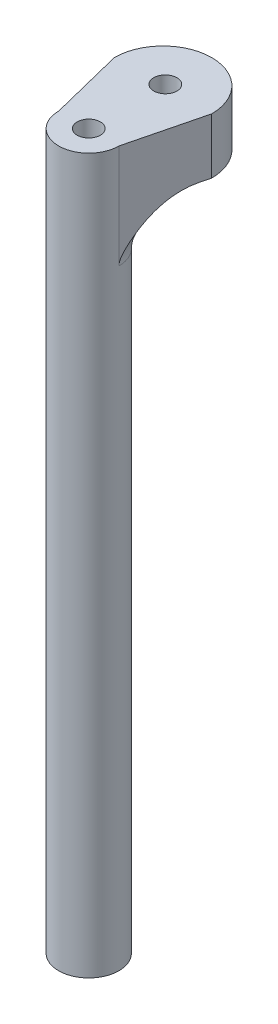
ISO-10303-21;
HEADER;
FILE_DESCRIPTION(('STEP AP214'),'2;1');
FILE_NAME('part.step','',(''),(''),'','','');
FILE_SCHEMA(('AUTOMOTIVE_DESIGN { 1 0 10303 214 1 1 1 1 }'));
ENDSEC;
DATA;
#1=APPLICATION_CONTEXT('core data for automotive mechanical design processes');
#2=APPLICATION_PROTOCOL_DEFINITION('international standard','automotive_design',2000,#1);
#3=PRODUCT_CONTEXT('',#1,'mechanical');
#4=PRODUCT('Part','Part','',(#3));
#5=PRODUCT_RELATED_PRODUCT_CATEGORY('part','',(#4));
#6=PRODUCT_DEFINITION_FORMATION('','',#4);
#7=PRODUCT_DEFINITION_CONTEXT('part definition',#1,'design');
#8=PRODUCT_DEFINITION('design','',#6,#7);
#9=PRODUCT_DEFINITION_SHAPE('','',#8);
#10=(LENGTH_UNIT() NAMED_UNIT(*) SI_UNIT(.MILLI.,.METRE.));
#11=(NAMED_UNIT(*) PLANE_ANGLE_UNIT() SI_UNIT($,.RADIAN.));
#12=(NAMED_UNIT(*) SI_UNIT($,.STERADIAN.) SOLID_ANGLE_UNIT());
#13=UNCERTAINTY_MEASURE_WITH_UNIT(LENGTH_MEASURE(1.E-05),#10,'distance_accuracy_value','');
#14=(GEOMETRIC_REPRESENTATION_CONTEXT(3) GLOBAL_UNCERTAINTY_ASSIGNED_CONTEXT((#13)) GLOBAL_UNIT_ASSIGNED_CONTEXT((#10,
#11,#12)) REPRESENTATION_CONTEXT('',''));
#15=CARTESIAN_POINT('',(0.,0.,0.));
#16=DIRECTION('',(0.,0.,1.));
#17=DIRECTION('',(1.,0.,0.));
#18=AXIS2_PLACEMENT_3D('',#15,#16,#17);
#19=CARTESIAN_POINT('',(-74.7372405372405,5.,-53.6030525030525));
#20=DIRECTION('',(0.,-1.,0.));
#21=DIRECTION('',(0.,0.,-1.));
#22=AXIS2_PLACEMENT_3D('',#19,#20,#21);
#23=CYLINDRICAL_SURFACE('',#22,3.25);
#24=CARTESIAN_POINT('',(-74.7372405372405,0.,-53.6030525030525));
#25=DIRECTION('',(0.,1.,0.));
#26=DIRECTION('',(0.,0.,1.));
#27=AXIS2_PLACEMENT_3D('',#24,#25,#26);
#28=CIRCLE('',#27,3.25);
#29=CARTESIAN_POINT('',(-74.7372405372405,0.,-50.3530525030525));
#30=VERTEX_POINT('',#29);
#31=EDGE_CURVE('E132',#30,#30,#28,.F.);
#32=ORIENTED_EDGE('',*,*,#31,.F.);
#33=EDGE_LOOP('',(#32));
#34=FACE_BOUND('',#33,.T.);
#35=DIRECTION('',(0.,-1.,0.));
#36=VECTOR('',#35,1.);
#37=CARTESIAN_POINT('',(-77.9872405372405,77.,-53.6030525030525));
#38=LINE('',#37,#36);
#39=CARTESIAN_POINT('',(-77.9872405372405,77.,-53.6030525030525));
#40=VERTEX_POINT('',#39);
#41=CARTESIAN_POINT('',(-77.9872405372405,65.8,-53.6030525030525));
#42=VERTEX_POINT('',#41);
#43=EDGE_CURVE('E52',#40,#42,#38,.T.);
#44=ORIENTED_EDGE('',*,*,#43,.T.);
#45=CARTESIAN_POINT('',(-74.7372405372405,65.8,-53.6030525030525));
#46=DIRECTION('',(0.,1.,0.));
#47=DIRECTION('',(0.,0.,1.));
#48=AXIS2_PLACEMENT_3D('',#45,#46,#47);
#49=CIRCLE('',#48,3.25);
#50=CARTESIAN_POINT('',(-71.4872405372405,65.8,-53.6030525030525));
#51=VERTEX_POINT('',#50);
#52=EDGE_CURVE('E149',#42,#51,#49,.F.);
#53=ORIENTED_EDGE('',*,*,#52,.T.);
#54=DIRECTION('',(0.,-1.,0.));
#55=VECTOR('',#54,1.);
#56=CARTESIAN_POINT('',(-71.4872405372405,77.,-53.6030525030525));
#57=LINE('',#56,#55);
#58=CARTESIAN_POINT('',(-71.4872405372405,77.,-53.6030525030525));
#59=VERTEX_POINT('',#58);
#60=EDGE_CURVE('E59',#59,#51,#57,.T.);
#61=ORIENTED_EDGE('',*,*,#60,.F.);
#62=CARTESIAN_POINT('',(-74.7372405372405,77.,-53.6030525030525));
#63=DIRECTION('',(0.,1.,0.));
#64=DIRECTION('',(0.,0.,1.));
#65=AXIS2_PLACEMENT_3D('',#62,#63,#64);
#66=CIRCLE('',#65,3.25);
#67=EDGE_CURVE('E129',#40,#59,#66,.T.);
#68=ORIENTED_EDGE('',*,*,#67,.F.);
#69=EDGE_LOOP('',(#44,#53,#61,#68));
#70=FACE_BOUND('',#69,.T.);
#71=ADVANCED_FACE('F35',(#34,#70),#23,.T.);
#72=CARTESIAN_POINT('',(0.,0.,0.));
#73=DIRECTION('',(0.,1.,0.));
#74=DIRECTION('',(0.,0.,1.));
#75=AXIS2_PLACEMENT_3D('',#72,#73,#74);
#76=PLANE('',#75);
#77=CARTESIAN_POINT('',(-74.7372405372405,0.,-53.6030525030525));
#78=DIRECTION('',(0.,-1.,0.));
#79=DIRECTION('',(0.,0.,-1.));
#80=AXIS2_PLACEMENT_3D('',#77,#78,#79);
#81=CIRCLE('',#80,1.25);
#82=CARTESIAN_POINT('',(-74.7372405372405,0.,-54.8530525030525));
#83=VERTEX_POINT('',#82);
#84=EDGE_CURVE('E117',#83,#83,#81,.T.);
#85=ORIENTED_EDGE('',*,*,#84,.F.);
#86=EDGE_LOOP('',(#85));
#87=FACE_BOUND('',#86,.T.);
#88=ORIENTED_EDGE('',*,*,#31,.T.);
#89=EDGE_LOOP('',(#88));
#90=FACE_BOUND('',#89,.T.);
#91=ADVANCED_FACE('F175',(#87,#90),#76,.F.);
#92=CARTESIAN_POINT('',(-74.7372405372405,71.,-53.6030525030525));
#93=DIRECTION('',(0.,1.,0.));
#94=DIRECTION('',(0.,0.,1.));
#95=AXIS2_PLACEMENT_3D('',#92,#93,#94);
#96=PLANE('',#95);
#97=DIRECTION('',(0.242535625036333,0.,-0.970142500145332));
#98=VECTOR('',#97,1.);
#99=CARTESIAN_POINT('',(-71.4872405372405,71.,-53.6030525030525));
#100=LINE('',#99,#98);
#101=CARTESIAN_POINT('',(-69.7770038564284,71.,-60.4439992263011));
#102=VERTEX_POINT('',#101);
#103=CARTESIAN_POINT('',(-69.4872405372405,71.,-61.6030525030525));
#104=VERTEX_POINT('',#103);
#105=EDGE_CURVE('E88',#102,#104,#100,.T.);
#106=ORIENTED_EDGE('',*,*,#105,.F.);
#107=CARTESIAN_POINT('',(-74.7372405372405,71.,-53.6030525030525));
#108=DIRECTION('',(0.,1.,0.));
#109=DIRECTION('',(0.,0.,1.));
#110=AXIS2_PLACEMENT_3D('',#107,#108,#109);
#111=CIRCLE('',#110,8.45);
#112=CARTESIAN_POINT('',(-73.4918912550266,71.,-61.9607797757798));
#113=VERTEX_POINT('',#112);
#114=EDGE_CURVE('E147',#102,#113,#111,.T.);
#115=ORIENTED_EDGE('',*,*,#114,.T.);
#116=CARTESIAN_POINT('',(-74.7372405372405,71.,-61.8530525030525));
#117=DIRECTION('',(0.,1.,0.));
#118=DIRECTION('',(0.,0.,1.));
#119=AXIS2_PLACEMENT_3D('',#116,#117,#118);
#120=CIRCLE('',#119,1.25);
#121=CARTESIAN_POINT('',(-75.9825898194545,71.,-61.9607797757798));
#122=VERTEX_POINT('',#121);
#123=EDGE_CURVE('E126',#113,#122,#120,.T.);
#124=ORIENTED_EDGE('',*,*,#123,.T.);
#125=CARTESIAN_POINT('',(-74.7372405372405,71.,-53.6030525030525));
#126=DIRECTION('',(0.,1.,0.));
#127=DIRECTION('',(0.,0.,1.));
#128=AXIS2_PLACEMENT_3D('',#125,#126,#127);
#129=CIRCLE('',#128,8.45);
#130=CARTESIAN_POINT('',(-79.6974772180527,71.,-60.4439992263011));
#131=VERTEX_POINT('',#130);
#132=EDGE_CURVE('E135',#122,#131,#129,.T.);
#133=ORIENTED_EDGE('',*,*,#132,.T.);
#134=DIRECTION('',(0.242535625036333,0.,0.970142500145332));
#135=VECTOR('',#134,1.);
#136=CARTESIAN_POINT('',(-77.9872405372405,71.,-53.6030525030525));
#137=LINE('',#136,#135);
#138=CARTESIAN_POINT('',(-79.9872405372405,71.,-61.6030525030525));
#139=VERTEX_POINT('',#138);
#140=EDGE_CURVE('E108',#139,#131,#137,.T.);
#141=ORIENTED_EDGE('',*,*,#140,.F.);
#142=CARTESIAN_POINT('',(-74.7372405372405,71.,-61.6030525030525));
#143=DIRECTION('',(0.,1.,0.));
#144=DIRECTION('',(0.,0.,1.));
#145=AXIS2_PLACEMENT_3D('',#142,#143,#144);
#146=CIRCLE('',#145,5.25);
#147=EDGE_CURVE('E98',#104,#139,#146,.T.);
#148=ORIENTED_EDGE('',*,*,#147,.F.);
#149=EDGE_LOOP('',(#106,#115,#124,#133,#141,#148));
#150=FACE_BOUND('',#149,.T.);
#151=ADVANCED_FACE('F111',(#150),#96,.F.);
#152=CARTESIAN_POINT('',(-74.7372405372405,77.,-53.6030525030525));
#153=DIRECTION('',(0.,1.,0.));
#154=DIRECTION('',(0.,0.,1.));
#155=AXIS2_PLACEMENT_3D('',#152,#153,#154);
#156=PLANE('',#155);
#157=CARTESIAN_POINT('',(-74.7372405372405,77.,-53.6030525030525));
#158=DIRECTION('',(0.,1.,0.));
#159=DIRECTION('',(0.,0.,1.));
#160=AXIS2_PLACEMENT_3D('',#157,#158,#159);
#161=CIRCLE('',#160,1.25);
#162=CARTESIAN_POINT('',(-74.7372405372405,77.,-52.3530525030525));
#163=VERTEX_POINT('',#162);
#164=EDGE_CURVE('E40',#163,#163,#161,.T.);
#165=ORIENTED_EDGE('',*,*,#164,.F.);
#166=EDGE_LOOP('',(#165));
#167=FACE_BOUND('',#166,.T.);
#168=CARTESIAN_POINT('',(-74.7372405372405,77.,-61.8530525030525));
#169=DIRECTION('',(0.,1.,0.));
#170=DIRECTION('',(0.,0.,1.));
#171=AXIS2_PLACEMENT_3D('',#168,#169,#170);
#172=CIRCLE('',#171,1.25);
#173=CARTESIAN_POINT('',(-74.7372405372405,77.,-60.6030525030525));
#174=VERTEX_POINT('',#173);
#175=EDGE_CURVE('E122',#174,#174,#172,.T.);
#176=ORIENTED_EDGE('',*,*,#175,.F.);
#177=EDGE_LOOP('',(#176));
#178=FACE_BOUND('',#177,.T.);
#179=ORIENTED_EDGE('',*,*,#67,.T.);
#180=DIRECTION('',(0.242535625036333,0.,-0.970142500145332));
#181=VECTOR('',#180,1.);
#182=CARTESIAN_POINT('',(-71.4872405372405,77.,-53.6030525030525));
#183=LINE('',#182,#181);
#184=CARTESIAN_POINT('',(-69.4872405372405,77.,-61.6030525030525));
#185=VERTEX_POINT('',#184);
#186=EDGE_CURVE('E118',#59,#185,#183,.T.);
#187=ORIENTED_EDGE('',*,*,#186,.T.);
#188=CARTESIAN_POINT('',(-74.7372405372405,77.,-61.6030525030525));
#189=DIRECTION('',(0.,1.,0.));
#190=DIRECTION('',(0.,0.,1.));
#191=AXIS2_PLACEMENT_3D('',#188,#189,#190);
#192=CIRCLE('',#191,5.25);
#193=CARTESIAN_POINT('',(-79.9872405372405,77.,-61.6030525030525));
#194=VERTEX_POINT('',#193);
#195=EDGE_CURVE('E105',#185,#194,#192,.T.);
#196=ORIENTED_EDGE('',*,*,#195,.T.);
#197=DIRECTION('',(0.242535625036333,0.,0.970142500145332));
#198=VECTOR('',#197,1.);
#199=CARTESIAN_POINT('',(-77.9872405372405,77.,-53.6030525030525));
#200=LINE('',#199,#198);
#201=EDGE_CURVE('E99',#194,#40,#200,.T.);
#202=ORIENTED_EDGE('',*,*,#201,.T.);
#203=EDGE_LOOP('',(#179,#187,#196,#202));
#204=FACE_BOUND('',#203,.T.);
#205=ADVANCED_FACE('F166',(#167,#178,#204),#156,.T.);
#206=CARTESIAN_POINT('',(-74.7372405372405,0.,-61.8530525030525));
#207=DIRECTION('',(0.,1.,0.));
#208=DIRECTION('',(0.,0.,1.));
#209=AXIS2_PLACEMENT_3D('',#206,#207,#208);
#210=CYLINDRICAL_SURFACE('',#209,1.25);
#211=ORIENTED_EDGE('',*,*,#175,.T.);
#212=EDGE_LOOP('',(#211));
#213=FACE_BOUND('',#212,.T.);
#214=ORIENTED_EDGE('',*,*,#123,.F.);
#215=CARTESIAN_POINT('',(-73.4918912550266,71.,-61.9607797757798));
#216=CARTESIAN_POINT('',(-73.4889204217911,71.0000014509433,-61.9264395412953));
#217=CARTESIAN_POINT('',(-73.4873728765762,70.9996752914443,-61.8919924851019));
#218=CARTESIAN_POINT('',(-73.4871243685805,70.9983473621518,-61.823104347288));
#219=CARTESIAN_POINT('',(-73.4884231456582,70.9973456541062,-61.7886632654091));
#220=CARTESIAN_POINT('',(-73.4965738459889,70.9933038313744,-61.6858542889453));
#221=CARTESIAN_POINT('',(-73.5076641381624,70.9892272362845,-61.6178128843935));
#222=CARTESIAN_POINT('',(-73.5407780274561,70.9784316780869,-61.4846902523086));
#223=CARTESIAN_POINT('',(-73.562804346338,70.9717120572687,-61.4196097660935));
#224=CARTESIAN_POINT('',(-73.6170695724907,70.9560663430061,-61.2941354251295));
#225=CARTESIAN_POINT('',(-73.6493096490734,70.9471399969526,-61.2337421079725));
#226=CARTESIAN_POINT('',(-73.723598237355,70.9276530851076,-61.1183351306008));
#227=CARTESIAN_POINT('',(-73.7657844872192,70.9170703445442,-61.0634140227005));
#228=CARTESIAN_POINT('',(-73.8585717372858,70.895350620662,-60.9613111806998));
#229=CARTESIAN_POINT('',(-73.9091758409573,70.8842134339968,-60.9141323137763));
#230=CARTESIAN_POINT('',(-74.0191126485459,70.8622236039409,-60.8274645145707));
#231=CARTESIAN_POINT('',(-74.0786547271482,70.8513883873016,-60.7882361201243));
#232=CARTESIAN_POINT('',(-74.2037888108231,70.8316718228903,-60.720359725032));
#233=CARTESIAN_POINT('',(-74.2693796069342,70.822790085871,-60.6917096158004));
#234=CARTESIAN_POINT('',(-74.4038132385117,70.8082977638713,-60.6462867885435));
#235=CARTESIAN_POINT('',(-74.4725933241713,70.8026405650838,-60.6293440245708));
#236=CARTESIAN_POINT('',(-74.6122235947059,70.7952241770897,-60.6073153253162));
#237=CARTESIAN_POINT('',(-74.6830729803631,70.793463502598,-60.602224872108));
#238=CARTESIAN_POINT('',(-74.8211262689244,70.7940883545847,-60.6040544475083));
#239=CARTESIAN_POINT('',(-74.8883394892902,70.7962759115277,-60.6104009858751));
#240=CARTESIAN_POINT('',(-75.0206729711386,70.8041090790831,-60.6337571331615));
#241=CARTESIAN_POINT('',(-75.0857931289668,70.8097548606796,-60.65076726932));
#242=CARTESIAN_POINT('',(-75.212166830259,70.8237607070604,-60.6948542004095));
#243=CARTESIAN_POINT('',(-75.2734222525781,70.832119440598,-60.7219260589933));
#244=CARTESIAN_POINT('',(-75.3906506911696,70.8505557314956,-60.7853448955783));
#245=CARTESIAN_POINT('',(-75.4466220359878,70.8606338299123,-60.8216947950235));
#246=CARTESIAN_POINT('',(-75.554577189642,70.8819327392582,-60.9047279070001));
#247=CARTESIAN_POINT('',(-75.6062348731979,70.8931852841794,-60.9518275545351));
#248=CARTESIAN_POINT('',(-75.7010410518512,70.9151955306606,-61.0540236364855));
#249=CARTESIAN_POINT('',(-75.7441897578883,70.9259532444826,-61.1091198726046));
#250=CARTESIAN_POINT('',(-75.8215445724645,70.9461395700159,-61.2270721720756));
#251=CARTESIAN_POINT('',(-75.8555620345929,70.9555385259055,-61.2900574676406));
#252=CARTESIAN_POINT('',(-75.9124335720114,70.9719249491607,-61.4211650868298));
#253=CARTESIAN_POINT('',(-75.9352897627477,70.9789128734264,-61.4892864341673));
#254=CARTESIAN_POINT('',(-75.9679850454627,70.9896459727656,-61.6243818762008));
#255=CARTESIAN_POINT('',(-75.9785405397451,70.9935646835085,-61.6911672419624));
#256=CARTESIAN_POINT('',(-75.986208065226,70.9974492205883,-61.7920257232079));
#257=CARTESIAN_POINT('',(-75.9873997903532,70.9984117694843,-61.8257957248794));
#258=CARTESIAN_POINT('',(-75.9870473328777,70.9996879165425,-61.8933382846045));
#259=CARTESIAN_POINT('',(-75.9855027847056,71.0000014279805,-61.9271108423967));
#260=CARTESIAN_POINT('',(-75.9825898194545,71.,-61.9607797757798));
#261=B_SPLINE_CURVE_WITH_KNOTS('',3,(#215,#216,#217,#218,#219,#220,#221,#222,#223,#224,#225,
#226,#227,#228,#229,#230,#231,#232,#233,#234,#235,#236,#237,#238,#239,#240,#241,#242,#243,#244,
#245,#246,#247,#248,#249,#250,#251,#252,#253,#254,#255,#256,#257,#258,#259,#260),.UNSPECIFIED.,
.F.,.F.,(4,2,2,2,2,2,2,2,2,2,2,2,2,2,2,2,2,2,2,2,2,2,4),(0.,0.103342006005118,0.206674567396435,
0.412781621006949,0.618939996336854,0.825121982040513,1.03434696729186,1.24364926063657,
1.4589781664383,1.6742641271985,1.88635339052155,2.09836179529726,2.30003337193218,
2.50171492057421,2.70329765325254,2.90494393822022,3.11639299049292,3.32783680023164,
3.54336111307592,3.75884456075306,3.96102722049747,4.06233918059838,4.16366467711932),.UNSPECIFIED.);
#262=EDGE_CURVE('E151',#113,#122,#261,.T.);
#263=ORIENTED_EDGE('',*,*,#262,.T.);
#264=EDGE_LOOP('',(#214,#263));
#265=FACE_BOUND('',#264,.T.);
#266=ADVANCED_FACE('F161',(#213,#265),#210,.F.);
#267=CARTESIAN_POINT('',(-71.4872405372405,71.,-53.6030525030525));
#268=DIRECTION('',(0.970142500145332,0.,0.242535625036333));
#269=DIRECTION('',(0.242535625036333,0.,-0.970142500145332));
#270=AXIS2_PLACEMENT_3D('',#267,#268,#269);
#271=PLANE('',#270);
#272=ORIENTED_EDGE('',*,*,#186,.F.);
#273=ORIENTED_EDGE('',*,*,#60,.T.);
#274=CARTESIAN_POINT('',(-71.4872405372405,65.8,-53.6030525030525));
#275=CARTESIAN_POINT('',(-71.487256364011,65.8453703925842,-53.6029891959705));
#276=CARTESIAN_POINT('',(-71.4866468585086,65.890690622545,-53.6054272179801));
#277=CARTESIAN_POINT('',(-71.4843086918323,65.9806702925419,-53.6147798846854));
#278=CARTESIAN_POINT('',(-71.4825843237867,66.0253315979973,-53.6216773568677));
#279=CARTESIAN_POINT('',(-71.4781875573245,66.112960100241,-53.6392644227165));
#280=CARTESIAN_POINT('',(-71.4755334690119,66.1559433587355,-53.6498807759669));
#281=CARTESIAN_POINT('',(-71.469436779498,66.2409771787368,-53.6742675340229));
#282=CARTESIAN_POINT('',(-71.4659934047054,66.2830267805075,-53.6880410331931));
#283=CARTESIAN_POINT('',(-71.452749254557,66.4296251896035,-53.7410176337867));
#284=CARTESIAN_POINT('',(-71.4412692694619,66.5315695523679,-53.7869375741672));
#285=CARTESIAN_POINT('',(-71.4160811721008,66.730662455606,-53.8876899636116));
#286=CARTESIAN_POINT('',(-71.4023679033192,66.8277992021704,-53.9425430387377));
#287=CARTESIAN_POINT('',(-71.3732549486395,67.0204507077413,-54.0589948574567));
#288=CARTESIAN_POINT('',(-71.3578263034752,67.1158906398999,-54.120709438114));
#289=CARTESIAN_POINT('',(-71.3259704284188,67.3037007860756,-54.2481329383395));
#290=CARTESIAN_POINT('',(-71.3095443193538,67.3960742715885,-54.3138373745994));
#291=CARTESIAN_POINT('',(-71.2737056887979,67.5900747242099,-54.457191896823));
#292=CARTESIAN_POINT('',(-71.2541818217558,67.6913517600254,-54.5352873649915));
#293=CARTESIAN_POINT('',(-71.2142443132623,67.8908842174965,-54.6950373989654));
#294=CARTESIAN_POINT('',(-71.1938305486913,67.9891392178177,-54.7766924572496));
#295=CARTESIAN_POINT('',(-71.131317533586,68.279542729069,-55.0267445176706));
#296=CARTESIAN_POINT('',(-71.0879734228571,68.4671857749726,-55.2001209605864));
#297=CARTESIAN_POINT('',(-70.9985419247404,68.827125734719,-55.5578469530531));
#298=CARTESIAN_POINT('',(-70.9524868131306,68.9995589723765,-55.7420673994923));
#299=CARTESIAN_POINT('',(-70.8572227157209,69.3287838597185,-56.1231237891311));
#300=CARTESIAN_POINT('',(-70.8080157352035,69.4855852954646,-56.3199517112008));
#301=CARTESIAN_POINT('',(-70.7165018204505,69.7517085290788,-56.6860073702127));
#302=CARTESIAN_POINT('',(-70.6747522148603,69.8642905026605,-56.8530057925737));
#303=CARTESIAN_POINT('',(-70.5893009958962,70.0761760215933,-57.1948106684298));
#304=CARTESIAN_POINT('',(-70.5455992198622,70.1754784576938,-57.3696177725657));
#305=CARTESIAN_POINT('',(-70.4563696375862,70.3592848457791,-57.72653610167));
#306=CARTESIAN_POINT('',(-70.4108409583158,70.4437816164855,-57.9086508187516));
#307=CARTESIAN_POINT('',(-70.3181959522352,70.5963894696379,-58.2792308430737));
#308=CARTESIAN_POINT('',(-70.2710799824753,70.6645042094209,-58.4676947221134));
#309=CARTESIAN_POINT('',(-70.1872190905308,70.7684704854733,-58.8031382898915));
#310=CARTESIAN_POINT('',(-70.1507505415577,70.8081388226581,-58.9490124857839));
#311=CARTESIAN_POINT('',(-70.0772306273534,70.8767470684812,-59.2430921426011));
#312=CARTESIAN_POINT('',(-70.0401794160614,70.9056897627927,-59.391296987769));
#313=CARTESIAN_POINT('',(-69.9655629449365,70.9524109464207,-59.6897628722687));
#314=CARTESIAN_POINT('',(-69.9279965879975,70.970159822674,-59.8400283000247));
#315=CARTESIAN_POINT('',(-69.8526239323666,70.9939656029918,-60.1415189225482));
#316=CARTESIAN_POINT('',(-69.8148174979131,71.0000151639498,-60.2927446603624));
#317=CARTESIAN_POINT('',(-69.7770038564284,71.,-60.4439992263011));
#318=B_SPLINE_CURVE_WITH_KNOTS('',3,(#274,#275,#276,#277,#278,#279,#280,#281,#282,#283,#284,
#285,#286,#287,#288,#289,#290,#291,#292,#293,#294,#295,#296,#297,#298,#299,#300,#301,#302,#303,
#304,#305,#306,#307,#308,#309,#310,#311,#312,#313,#314,#315,#316,#317),.UNSPECIFIED.,.F.,.F.,(4,
2,2,2,2,2,2,2,2,2,2,2,2,2,2,2,2,2,2,2,2,4),(0.,0.135961631690666,0.271402793905329,
0.404314023359705,0.537356082315366,0.873538137785497,1.21050771856,1.55443042693416,
1.89797358289702,2.28598521469515,2.67405070037367,3.45072541467543,4.2195241481125,
4.98783852339895,5.60436742915199,6.22094780194402,6.83782641542201,7.45456718081135,
7.92073468336897,8.3867810275086,8.85405517427446,9.32162251184701),.UNSPECIFIED.);
#319=EDGE_CURVE('E11',#51,#102,#318,.T.);
#320=ORIENTED_EDGE('',*,*,#319,.T.);
#321=ORIENTED_EDGE('',*,*,#105,.T.);
#322=DIRECTION('',(0.,1.,0.));
#323=VECTOR('',#322,1.);
#324=CARTESIAN_POINT('',(-69.4872405372405,71.,-61.6030525030525));
#325=LINE('',#324,#323);
#326=EDGE_CURVE('E91',#104,#185,#325,.T.);
#327=ORIENTED_EDGE('',*,*,#326,.T.);
#328=EDGE_LOOP('',(#272,#273,#320,#321,#327));
#329=FACE_BOUND('',#328,.T.);
#330=ADVANCED_FACE('F90',(#329),#271,.T.);
#331=CARTESIAN_POINT('',(-77.9872405372405,71.,-53.6030525030525));
#332=DIRECTION('',(-0.970142500145332,0.,0.242535625036333));
#333=DIRECTION('',(0.242535625036333,0.,0.970142500145332));
#334=AXIS2_PLACEMENT_3D('',#331,#332,#333);
#335=PLANE('',#334);
#336=ORIENTED_EDGE('',*,*,#201,.F.);
#337=DIRECTION('',(0.,1.,0.));
#338=VECTOR('',#337,1.);
#339=CARTESIAN_POINT('',(-79.9872405372405,71.,-61.6030525030525));
#340=LINE('',#339,#338);
#341=EDGE_CURVE('E107',#139,#194,#340,.T.);
#342=ORIENTED_EDGE('',*,*,#341,.F.);
#343=ORIENTED_EDGE('',*,*,#140,.T.);
#344=CARTESIAN_POINT('',(-79.6974772180527,71.,-60.4439992263011));
#345=CARTESIAN_POINT('',(-79.6537168794388,71.0000271958625,-60.2689578718457));
#346=CARTESIAN_POINT('',(-79.6099691702899,70.9919193464238,-60.0939670352499));
#347=CARTESIAN_POINT('',(-79.5228402441809,70.9601163471144,-59.745451330814));
#348=CARTESIAN_POINT('',(-79.4794587714082,70.9364331809003,-59.571925439723));
#349=CARTESIAN_POINT('',(-79.3937294409849,70.8744452669311,-59.22900811803));
#350=CARTESIAN_POINT('',(-79.3513757573158,70.83627631745,-59.0595933833537));
#351=CARTESIAN_POINT('',(-79.2675397389597,70.746106471874,-58.724249309929));
#352=CARTESIAN_POINT('',(-79.2260575477043,70.694103317869,-58.5583205449073));
#353=CARTESIAN_POINT('',(-79.1438317565558,70.5766581903644,-58.2294173803135));
#354=CARTESIAN_POINT('',(-79.1030975786736,70.5111044710101,-58.0664806687846));
#355=CARTESIAN_POINT('',(-79.0229080835644,70.3678190111981,-57.7457226883481));
#356=CARTESIAN_POINT('',(-78.983452923832,70.2900857778144,-57.5879020494183));
#357=CARTESIAN_POINT('',(-78.9058218526235,70.1231849763923,-57.2773777645843));
#358=CARTESIAN_POINT('',(-78.8676508384864,70.0339787845808,-57.124693708036));
#359=CARTESIAN_POINT('',(-78.7928241334774,69.8454061396829,-56.825386888));
#360=CARTESIAN_POINT('',(-78.7561683978366,69.746039987074,-56.6787639454367));
#361=CARTESIAN_POINT('',(-78.6639249650783,69.4787878811557,-56.3097902144036));
#362=CARTESIAN_POINT('',(-78.6094786432051,69.3041750565702,-56.0920049269105));
#363=CARTESIAN_POINT('',(-78.5044313694882,68.9359554929914,-55.671815832043));
#364=CARTESIAN_POINT('',(-78.4538347052743,68.7423281102603,-55.4694291751877));
#365=CARTESIAN_POINT('',(-78.3808693894582,68.4401075918747,-55.1775679119231));
#366=CARTESIAN_POINT('',(-78.3570404501695,68.337426277563,-55.0822521547682));
#367=CARTESIAN_POINT('',(-78.3103643347335,68.1283416604069,-54.8955476930242));
#368=CARTESIAN_POINT('',(-78.2875170696064,68.0219386964887,-54.8041586325159));
#369=CARTESIAN_POINT('',(-78.2428799736607,67.8056241715692,-54.6256102487331));
#370=CARTESIAN_POINT('',(-78.2210890491782,67.6957164435167,-54.5384465508032));
#371=CARTESIAN_POINT('',(-78.1786753667413,67.4721557228321,-54.3687918210555));
#372=CARTESIAN_POINT('',(-78.1580522584586,67.3585038697411,-54.2862993879246));
#373=CARTESIAN_POINT('',(-78.1278584973316,67.182422343591,-54.1655243434166));
#374=CARTESIAN_POINT('',(-78.1177356453896,67.1216007780592,-54.1250329356485));
#375=CARTESIAN_POINT('',(-78.0979939762478,66.9985632947554,-54.0460662590817));
#376=CARTESIAN_POINT('',(-78.0883752261895,66.9363471928126,-54.0075912588482));
#377=CARTESIAN_POINT('',(-78.0697881515777,66.8102557778081,-53.9332429604011));
#378=CARTESIAN_POINT('',(-78.0608199301533,66.7463802038391,-53.8973700747035));
#379=CARTESIAN_POINT('',(-78.0437847106792,66.6166331292166,-53.8292291968071));
#380=CARTESIAN_POINT('',(-78.0357173338367,66.5507624823885,-53.7969596894371));
#381=CARTESIAN_POINT('',(-78.0188699700814,66.39865140985,-53.7295702344158));
#382=CARTESIAN_POINT('',(-78.0104737007229,66.3116634525666,-53.695985156982));
#383=CARTESIAN_POINT('',(-77.9970708288326,66.1335465221267,-53.6423736694209));
#384=CARTESIAN_POINT('',(-77.9920426058985,66.0424480481373,-53.6222607776842));
#385=CARTESIAN_POINT('',(-77.9886868700923,65.9253608849547,-53.6088378344594));
#386=CARTESIAN_POINT('',(-77.988147347003,65.9003850498948,-53.6066797421025));
#387=CARTESIAN_POINT('',(-77.9874236021056,65.8502754642213,-53.6037847625126));
#388=CARTESIAN_POINT('',(-77.9872403887822,65.8251414667978,-53.6030519092193));
#389=CARTESIAN_POINT('',(-77.9872405372405,65.8,-53.6030525030525));
#390=B_SPLINE_CURVE_WITH_KNOTS('',3,(#344,#345,#346,#347,#348,#349,#350,#351,#352,#353,#354,
#355,#356,#357,#358,#359,#360,#361,#362,#363,#364,#365,#366,#367,#368,#369,#370,#371,#372,#373,
#374,#375,#376,#377,#378,#379,#380,#381,#382,#383,#384,#385,#386,#387,#388,#389),.UNSPECIFIED.,
.F.,.F.,(4,2,2,2,2,2,2,2,2,2,2,2,2,2,2,2,2,2,2,2,2,2,4),(0.,0.541026914968274,1.08163804979239,
1.61730158768031,2.15305260605572,2.69341185879239,3.23383739894133,3.77613239318502,
4.31841135386941,5.17033757376753,6.02319915983643,6.44945645458129,6.87567503114426,
7.30144246875372,7.72708149806396,7.94834493630902,8.16963777011839,8.390965609386,
8.6122000300561,8.89243441112166,9.17085219656177,9.24603885915985,9.32143801914497),.UNSPECIFIED.);
#391=EDGE_CURVE('E45',#131,#42,#390,.T.);
#392=ORIENTED_EDGE('',*,*,#391,.T.);
#393=ORIENTED_EDGE('',*,*,#43,.F.);
#394=EDGE_LOOP('',(#336,#342,#343,#392,#393));
#395=FACE_BOUND('',#394,.T.);
#396=ADVANCED_FACE('F209',(#395),#335,.T.);
#397=CARTESIAN_POINT('',(-74.7372405372405,71.,-61.6030525030525));
#398=DIRECTION('',(0.,1.,0.));
#399=DIRECTION('',(0.,0.,1.));
#400=AXIS2_PLACEMENT_3D('',#397,#398,#399);
#401=CYLINDRICAL_SURFACE('',#400,5.25);
#402=ORIENTED_EDGE('',*,*,#195,.F.);
#403=ORIENTED_EDGE('',*,*,#326,.F.);
#404=ORIENTED_EDGE('',*,*,#147,.T.);
#405=ORIENTED_EDGE('',*,*,#341,.T.);
#406=EDGE_LOOP('',(#402,#403,#404,#405));
#407=FACE_BOUND('',#406,.T.);
#408=ADVANCED_FACE('F103',(#407),#401,.T.);
#409=CARTESIAN_POINT('',(-74.7372405372405,65.8,-53.6030525030525));
#410=DIRECTION('',(0.,1.,0.));
#411=DIRECTION('',(0.,0.,1.));
#412=AXIS2_PLACEMENT_3D('',#409,#410,#411);
#413=TOROIDAL_SURFACE('',#412,8.45,5.2);
#414=ORIENTED_EDGE('',*,*,#319,.F.);
#415=ORIENTED_EDGE('',*,*,#52,.F.);
#416=ORIENTED_EDGE('',*,*,#391,.F.);
#417=ORIENTED_EDGE('',*,*,#132,.F.);
#418=ORIENTED_EDGE('',*,*,#262,.F.);
#419=ORIENTED_EDGE('',*,*,#114,.F.);
#420=EDGE_LOOP('',(#414,#415,#416,#417,#418,#419));
#421=FACE_BOUND('',#420,.T.);
#422=ADVANCED_FACE('F37',(#421),#413,.F.);
#423=CARTESIAN_POINT('',(-74.7372405372405,77.000025,-53.6030525030525));
#424=DIRECTION('',(0.,-1.,0.));
#425=DIRECTION('',(0.,0.,-1.));
#426=AXIS2_PLACEMENT_3D('',#423,#424,#425);
#427=CYLINDRICAL_SURFACE('',#426,1.25);
#428=ORIENTED_EDGE('',*,*,#164,.T.);
#429=EDGE_LOOP('',(#428));
#430=FACE_BOUND('',#429,.T.);
#431=ORIENTED_EDGE('',*,*,#84,.T.);
#432=EDGE_LOOP('',(#431));
#433=FACE_BOUND('',#432,.T.);
#434=ADVANCED_FACE('F224',(#430,#433),#427,.F.);
#435=CLOSED_SHELL('',(#71,#91,#151,#205,#266,#330,#396,#408,#422,#434));
#436=MANIFOLD_SOLID_BREP('B2',#435);
#437=ADVANCED_BREP_SHAPE_REPRESENTATION('',(#18,#436),#14);
#438=SHAPE_DEFINITION_REPRESENTATION(#9,#437);
ENDSEC;
END-ISO-10303-21;
